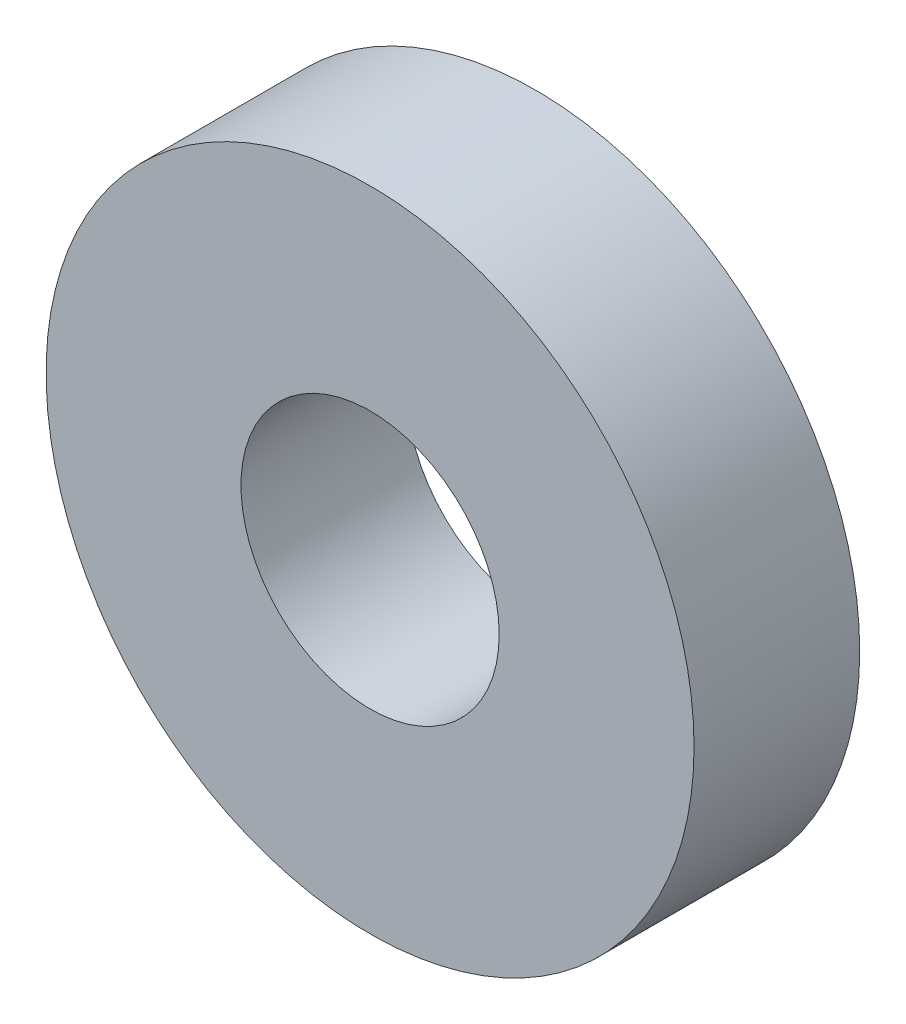
ISO-10303-21;
HEADER;
FILE_DESCRIPTION(('STEP AP214'),'2;1');
FILE_NAME('part.step','',(''),(''),'','','');
FILE_SCHEMA(('AUTOMOTIVE_DESIGN { 1 0 10303 214 1 1 1 1 }'));
ENDSEC;
DATA;
#1=APPLICATION_CONTEXT('core data for automotive mechanical design processes');
#2=APPLICATION_PROTOCOL_DEFINITION('international standard','automotive_design',2000,#1);
#3=PRODUCT_CONTEXT('',#1,'mechanical');
#4=PRODUCT('Part','Part','',(#3));
#5=PRODUCT_RELATED_PRODUCT_CATEGORY('part','',(#4));
#6=PRODUCT_DEFINITION_FORMATION('','',#4);
#7=PRODUCT_DEFINITION_CONTEXT('part definition',#1,'design');
#8=PRODUCT_DEFINITION('design','',#6,#7);
#9=PRODUCT_DEFINITION_SHAPE('','',#8);
#10=(LENGTH_UNIT() NAMED_UNIT(*) SI_UNIT(.MILLI.,.METRE.));
#11=(NAMED_UNIT(*) PLANE_ANGLE_UNIT() SI_UNIT($,.RADIAN.));
#12=(NAMED_UNIT(*) SI_UNIT($,.STERADIAN.) SOLID_ANGLE_UNIT());
#13=UNCERTAINTY_MEASURE_WITH_UNIT(LENGTH_MEASURE(1.E-05),#10,'distance_accuracy_value','');
#14=(GEOMETRIC_REPRESENTATION_CONTEXT(3) GLOBAL_UNCERTAINTY_ASSIGNED_CONTEXT((#13)) GLOBAL_UNIT_ASSIGNED_CONTEXT((#10,
#11,#12)) REPRESENTATION_CONTEXT('',''));
#15=CARTESIAN_POINT('',(0.,0.,0.));
#16=DIRECTION('',(0.,0.,1.));
#17=DIRECTION('',(1.,0.,0.));
#18=AXIS2_PLACEMENT_3D('',#15,#16,#17);
#19=CARTESIAN_POINT('',(0.,0.,3.4));
#20=DIRECTION('',(0.,0.,1.));
#21=DIRECTION('',(1.,0.,0.));
#22=AXIS2_PLACEMENT_3D('',#19,#20,#21);
#23=PLANE('',#22);
#24=CARTESIAN_POINT('',(0.,0.,3.4));
#25=DIRECTION('',(0.,0.,1.));
#26=DIRECTION('',(1.,0.,0.));
#27=AXIS2_PLACEMENT_3D('',#24,#25,#26);
#28=CIRCLE('',#27,6.65);
#29=CARTESIAN_POINT('',(6.65,0.,3.4));
#30=VERTEX_POINT('',#29);
#31=EDGE_CURVE('E10',#30,#30,#28,.T.);
#32=ORIENTED_EDGE('',*,*,#31,.T.);
#33=EDGE_LOOP('',(#32));
#34=FACE_BOUND('',#33,.T.);
#35=CARTESIAN_POINT('',(0.,0.,3.4));
#36=DIRECTION('',(0.,0.,1.));
#37=DIRECTION('',(1.,0.,0.));
#38=AXIS2_PLACEMENT_3D('',#35,#36,#37);
#39=CIRCLE('',#38,2.65);
#40=CARTESIAN_POINT('',(2.65,0.,3.4));
#41=VERTEX_POINT('',#40);
#42=EDGE_CURVE('E42',#41,#41,#39,.T.);
#43=ORIENTED_EDGE('',*,*,#42,.F.);
#44=EDGE_LOOP('',(#43));
#45=FACE_BOUND('',#44,.T.);
#46=ADVANCED_FACE('F31',(#34,#45),#23,.T.);
#47=CARTESIAN_POINT('',(0.,0.,0.));
#48=DIRECTION('',(0.,0.,1.));
#49=DIRECTION('',(1.,0.,0.));
#50=AXIS2_PLACEMENT_3D('',#47,#48,#49);
#51=PLANE('',#50);
#52=CARTESIAN_POINT('',(0.,0.,0.));
#53=DIRECTION('',(0.,0.,1.));
#54=DIRECTION('',(1.,0.,0.));
#55=AXIS2_PLACEMENT_3D('',#52,#53,#54);
#56=CIRCLE('',#55,6.65);
#57=CARTESIAN_POINT('',(6.65,0.,0.));
#58=VERTEX_POINT('',#57);
#59=EDGE_CURVE('E35',#58,#58,#56,.T.);
#60=ORIENTED_EDGE('',*,*,#59,.F.);
#61=EDGE_LOOP('',(#60));
#62=FACE_BOUND('',#61,.T.);
#63=CARTESIAN_POINT('',(0.,0.,0.));
#64=DIRECTION('',(0.,0.,1.));
#65=DIRECTION('',(1.,0.,0.));
#66=AXIS2_PLACEMENT_3D('',#63,#64,#65);
#67=CIRCLE('',#66,2.65);
#68=CARTESIAN_POINT('',(2.65,0.,0.));
#69=VERTEX_POINT('',#68);
#70=EDGE_CURVE('E44',#69,#69,#67,.T.);
#71=ORIENTED_EDGE('',*,*,#70,.T.);
#72=EDGE_LOOP('',(#71));
#73=FACE_BOUND('',#72,.T.);
#74=ADVANCED_FACE('F54',(#62,#73),#51,.F.);
#75=CARTESIAN_POINT('',(0.,0.,3.4));
#76=DIRECTION('',(0.,0.,-1.));
#77=DIRECTION('',(-1.,0.,0.));
#78=AXIS2_PLACEMENT_3D('',#75,#76,#77);
#79=CYLINDRICAL_SURFACE('',#78,6.65);
#80=ORIENTED_EDGE('',*,*,#31,.F.);
#81=EDGE_LOOP('',(#80));
#82=FACE_BOUND('',#81,.T.);
#83=ORIENTED_EDGE('',*,*,#59,.T.);
#84=EDGE_LOOP('',(#83));
#85=FACE_BOUND('',#84,.T.);
#86=ADVANCED_FACE('F33',(#82,#85),#79,.T.);
#87=CARTESIAN_POINT('',(0.,0.,3.4));
#88=DIRECTION('',(0.,0.,-1.));
#89=DIRECTION('',(-1.,0.,0.));
#90=AXIS2_PLACEMENT_3D('',#87,#88,#89);
#91=CYLINDRICAL_SURFACE('',#90,2.65);
#92=ORIENTED_EDGE('',*,*,#42,.T.);
#93=EDGE_LOOP('',(#92));
#94=FACE_BOUND('',#93,.T.);
#95=ORIENTED_EDGE('',*,*,#70,.F.);
#96=EDGE_LOOP('',(#95));
#97=FACE_BOUND('',#96,.T.);
#98=ADVANCED_FACE('F50',(#94,#97),#91,.F.);
#99=CLOSED_SHELL('',(#46,#74,#86,#98));
#100=MANIFOLD_SOLID_BREP('B2',#99);
#101=ADVANCED_BREP_SHAPE_REPRESENTATION('',(#18,#100),#14);
#102=SHAPE_DEFINITION_REPRESENTATION(#9,#101);
ENDSEC;
END-ISO-10303-21;
